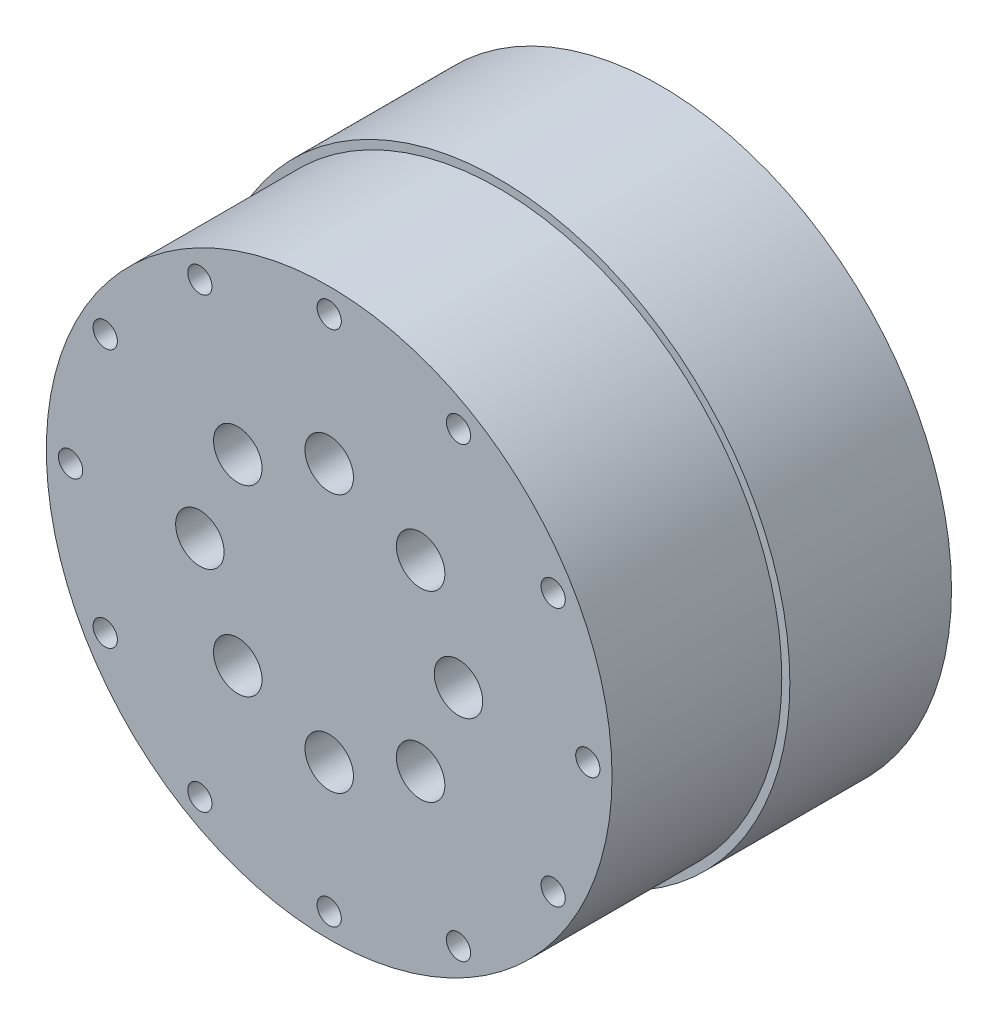
ISO-10303-21;
HEADER;
FILE_DESCRIPTION(('STEP AP214'),'2;1');
FILE_NAME('part.step','',(''),(''),'','','');
FILE_SCHEMA(('AUTOMOTIVE_DESIGN { 1 0 10303 214 1 1 1 1 }'));
ENDSEC;
DATA;
#1=APPLICATION_CONTEXT('core data for automotive mechanical design processes');
#2=APPLICATION_PROTOCOL_DEFINITION('international standard','automotive_design',2000,#1);
#3=PRODUCT_CONTEXT('',#1,'mechanical');
#4=PRODUCT('Part','Part','',(#3));
#5=PRODUCT_RELATED_PRODUCT_CATEGORY('part','',(#4));
#6=PRODUCT_DEFINITION_FORMATION('','',#4);
#7=PRODUCT_DEFINITION_CONTEXT('part definition',#1,'design');
#8=PRODUCT_DEFINITION('design','',#6,#7);
#9=PRODUCT_DEFINITION_SHAPE('','',#8);
#10=(LENGTH_UNIT() NAMED_UNIT(*) SI_UNIT(.MILLI.,.METRE.));
#11=(NAMED_UNIT(*) PLANE_ANGLE_UNIT() SI_UNIT($,.RADIAN.));
#12=(NAMED_UNIT(*) SI_UNIT($,.STERADIAN.) SOLID_ANGLE_UNIT());
#13=UNCERTAINTY_MEASURE_WITH_UNIT(LENGTH_MEASURE(1.E-05),#10,'distance_accuracy_value','');
#14=(GEOMETRIC_REPRESENTATION_CONTEXT(3) GLOBAL_UNCERTAINTY_ASSIGNED_CONTEXT((#13)) GLOBAL_UNIT_ASSIGNED_CONTEXT((#10,
#11,#12)) REPRESENTATION_CONTEXT('',''));
#15=CARTESIAN_POINT('',(0.,0.,0.));
#16=DIRECTION('',(0.,0.,1.));
#17=DIRECTION('',(1.,0.,0.));
#18=AXIS2_PLACEMENT_3D('',#15,#16,#17);
#19=CARTESIAN_POINT('',(0.,0.,41.));
#20=DIRECTION('',(0.,0.,1.));
#21=DIRECTION('',(1.,0.,0.));
#22=AXIS2_PLACEMENT_3D('',#19,#20,#21);
#23=PLANE('',#22);
#24=CARTESIAN_POINT('',(27.712812921102,16.,41.));
#25=DIRECTION('',(0.,0.,1.));
#26=DIRECTION('',(1.,0.,0.));
#27=AXIS2_PLACEMENT_3D('',#24,#25,#26);
#28=CIRCLE('',#27,1.5);
#29=CARTESIAN_POINT('',(29.212812921102,16.,41.));
#30=VERTEX_POINT('',#29);
#31=EDGE_CURVE('E106',#30,#30,#28,.T.);
#32=ORIENTED_EDGE('',*,*,#31,.F.);
#33=EDGE_LOOP('',(#32));
#34=FACE_BOUND('',#33,.T.);
#35=CARTESIAN_POINT('',(0.,32.,41.));
#36=DIRECTION('',(0.,0.,1.));
#37=DIRECTION('',(1.,0.,0.));
#38=AXIS2_PLACEMENT_3D('',#35,#36,#37);
#39=CIRCLE('',#38,1.5);
#40=CARTESIAN_POINT('',(1.5,32.,41.));
#41=VERTEX_POINT('',#40);
#42=EDGE_CURVE('E94',#41,#41,#39,.T.);
#43=ORIENTED_EDGE('',*,*,#42,.F.);
#44=EDGE_LOOP('',(#43));
#45=FACE_BOUND('',#44,.T.);
#46=CARTESIAN_POINT('',(-27.712812921102,16.,41.));
#47=DIRECTION('',(0.,0.,1.));
#48=DIRECTION('',(1.,0.,0.));
#49=AXIS2_PLACEMENT_3D('',#46,#47,#48);
#50=CIRCLE('',#49,1.5);
#51=CARTESIAN_POINT('',(-26.212812921102,16.,41.));
#52=VERTEX_POINT('',#51);
#53=EDGE_CURVE('E82',#52,#52,#50,.T.);
#54=ORIENTED_EDGE('',*,*,#53,.F.);
#55=EDGE_LOOP('',(#54));
#56=FACE_BOUND('',#55,.T.);
#57=CARTESIAN_POINT('',(-27.712812921102,-16.,41.));
#58=DIRECTION('',(0.,0.,1.));
#59=DIRECTION('',(1.,0.,0.));
#60=AXIS2_PLACEMENT_3D('',#57,#58,#59);
#61=CIRCLE('',#60,1.5);
#62=CARTESIAN_POINT('',(-26.212812921102,-16.,41.));
#63=VERTEX_POINT('',#62);
#64=EDGE_CURVE('E70',#63,#63,#61,.T.);
#65=ORIENTED_EDGE('',*,*,#64,.F.);
#66=EDGE_LOOP('',(#65));
#67=FACE_BOUND('',#66,.T.);
#68=CARTESIAN_POINT('',(0.,-32.,41.));
#69=DIRECTION('',(0.,0.,1.));
#70=DIRECTION('',(1.,0.,0.));
#71=AXIS2_PLACEMENT_3D('',#68,#69,#70);
#72=CIRCLE('',#71,1.5);
#73=CARTESIAN_POINT('',(1.5,-32.,41.));
#74=VERTEX_POINT('',#73);
#75=EDGE_CURVE('E58',#74,#74,#72,.T.);
#76=ORIENTED_EDGE('',*,*,#75,.F.);
#77=EDGE_LOOP('',(#76));
#78=FACE_BOUND('',#77,.T.);
#79=CARTESIAN_POINT('',(27.712812921102,-16.,41.));
#80=DIRECTION('',(0.,0.,1.));
#81=DIRECTION('',(1.,0.,0.));
#82=AXIS2_PLACEMENT_3D('',#79,#80,#81);
#83=CIRCLE('',#82,1.5);
#84=CARTESIAN_POINT('',(29.212812921102,-16.,41.));
#85=VERTEX_POINT('',#84);
#86=EDGE_CURVE('E47',#85,#85,#83,.T.);
#87=ORIENTED_EDGE('',*,*,#86,.F.);
#88=EDGE_LOOP('',(#87));
#89=FACE_BOUND('',#88,.T.);
#90=CARTESIAN_POINT('',(32.,0.,41.));
#91=DIRECTION('',(0.,0.,1.));
#92=DIRECTION('',(1.,0.,0.));
#93=AXIS2_PLACEMENT_3D('',#90,#91,#92);
#94=CIRCLE('',#93,1.5);
#95=CARTESIAN_POINT('',(33.5,0.,41.));
#96=VERTEX_POINT('',#95);
#97=EDGE_CURVE('E38',#96,#96,#94,.T.);
#98=ORIENTED_EDGE('',*,*,#97,.F.);
#99=EDGE_LOOP('',(#98));
#100=FACE_BOUND('',#99,.T.);
#101=CARTESIAN_POINT('',(16.,-27.712812921102,41.));
#102=DIRECTION('',(0.,0.,1.));
#103=DIRECTION('',(1.,0.,0.));
#104=AXIS2_PLACEMENT_3D('',#101,#102,#103);
#105=CIRCLE('',#104,1.5);
#106=CARTESIAN_POINT('',(17.5,-27.712812921102,41.));
#107=VERTEX_POINT('',#106);
#108=EDGE_CURVE('E52',#107,#107,#105,.T.);
#109=ORIENTED_EDGE('',*,*,#108,.F.);
#110=EDGE_LOOP('',(#109));
#111=FACE_BOUND('',#110,.T.);
#112=CARTESIAN_POINT('',(-16.,-27.712812921102,41.));
#113=DIRECTION('',(0.,0.,1.));
#114=DIRECTION('',(1.,0.,0.));
#115=AXIS2_PLACEMENT_3D('',#112,#113,#114);
#116=CIRCLE('',#115,1.5);
#117=CARTESIAN_POINT('',(-14.5,-27.712812921102,41.));
#118=VERTEX_POINT('',#117);
#119=EDGE_CURVE('E64',#118,#118,#116,.T.);
#120=ORIENTED_EDGE('',*,*,#119,.F.);
#121=EDGE_LOOP('',(#120));
#122=FACE_BOUND('',#121,.T.);
#123=CARTESIAN_POINT('',(-32.,0.,41.));
#124=DIRECTION('',(0.,0.,1.));
#125=DIRECTION('',(1.,0.,0.));
#126=AXIS2_PLACEMENT_3D('',#123,#124,#125);
#127=CIRCLE('',#126,1.5);
#128=CARTESIAN_POINT('',(-30.5,0.,41.));
#129=VERTEX_POINT('',#128);
#130=EDGE_CURVE('E76',#129,#129,#127,.T.);
#131=ORIENTED_EDGE('',*,*,#130,.F.);
#132=EDGE_LOOP('',(#131));
#133=FACE_BOUND('',#132,.T.);
#134=CARTESIAN_POINT('',(-16.,27.712812921102,41.));
#135=DIRECTION('',(0.,0.,1.));
#136=DIRECTION('',(1.,0.,0.));
#137=AXIS2_PLACEMENT_3D('',#134,#135,#136);
#138=CIRCLE('',#137,1.5);
#139=CARTESIAN_POINT('',(-14.5,27.712812921102,41.));
#140=VERTEX_POINT('',#139);
#141=EDGE_CURVE('E88',#140,#140,#138,.T.);
#142=ORIENTED_EDGE('',*,*,#141,.F.);
#143=EDGE_LOOP('',(#142));
#144=FACE_BOUND('',#143,.T.);
#145=CARTESIAN_POINT('',(16.,27.7128129211021,41.));
#146=DIRECTION('',(0.,0.,1.));
#147=DIRECTION('',(1.,0.,0.));
#148=AXIS2_PLACEMENT_3D('',#145,#146,#147);
#149=CIRCLE('',#148,1.5);
#150=CARTESIAN_POINT('',(17.5,27.7128129211021,41.));
#151=VERTEX_POINT('',#150);
#152=EDGE_CURVE('E100',#151,#151,#149,.T.);
#153=ORIENTED_EDGE('',*,*,#152,.F.);
#154=EDGE_LOOP('',(#153));
#155=FACE_BOUND('',#154,.T.);
#156=CARTESIAN_POINT('',(16.,0.,41.));
#157=DIRECTION('',(0.,0.,1.));
#158=DIRECTION('',(1.,0.,0.));
#159=AXIS2_PLACEMENT_3D('',#156,#157,#158);
#160=CIRCLE('',#159,3.);
#161=CARTESIAN_POINT('',(19.,0.,41.));
#162=VERTEX_POINT('',#161);
#163=EDGE_CURVE('E115',#162,#162,#160,.T.);
#164=ORIENTED_EDGE('',*,*,#163,.F.);
#165=EDGE_LOOP('',(#164));
#166=FACE_BOUND('',#165,.T.);
#167=CARTESIAN_POINT('',(11.3137084989847,-11.3137084989848,41.));
#168=DIRECTION('',(0.,0.,1.));
#169=DIRECTION('',(1.,0.,0.));
#170=AXIS2_PLACEMENT_3D('',#167,#168,#169);
#171=CIRCLE('',#170,3.);
#172=CARTESIAN_POINT('',(14.3137084989847,-11.3137084989848,41.));
#173=VERTEX_POINT('',#172);
#174=EDGE_CURVE('E158',#173,#173,#171,.T.);
#175=ORIENTED_EDGE('',*,*,#174,.F.);
#176=EDGE_LOOP('',(#175));
#177=FACE_BOUND('',#176,.T.);
#178=CARTESIAN_POINT('',(0.,-16.,41.));
#179=DIRECTION('',(0.,0.,1.));
#180=DIRECTION('',(1.,0.,0.));
#181=AXIS2_PLACEMENT_3D('',#178,#179,#180);
#182=CIRCLE('',#181,3.);
#183=CARTESIAN_POINT('',(2.99999999999995,-16.,41.));
#184=VERTEX_POINT('',#183);
#185=EDGE_CURVE('E152',#184,#184,#182,.T.);
#186=ORIENTED_EDGE('',*,*,#185,.F.);
#187=EDGE_LOOP('',(#186));
#188=FACE_BOUND('',#187,.T.);
#189=CARTESIAN_POINT('',(-11.3137084989848,-11.3137084989847,41.));
#190=DIRECTION('',(0.,0.,1.));
#191=DIRECTION('',(1.,0.,0.));
#192=AXIS2_PLACEMENT_3D('',#189,#190,#191);
#193=CIRCLE('',#192,3.);
#194=CARTESIAN_POINT('',(-8.31370849898482,-11.3137084989847,41.));
#195=VERTEX_POINT('',#194);
#196=EDGE_CURVE('E146',#195,#195,#193,.T.);
#197=ORIENTED_EDGE('',*,*,#196,.F.);
#198=EDGE_LOOP('',(#197));
#199=FACE_BOUND('',#198,.T.);
#200=CARTESIAN_POINT('',(-16.,1.1172740284298E-13,41.));
#201=DIRECTION('',(0.,0.,1.));
#202=DIRECTION('',(1.,0.,0.));
#203=AXIS2_PLACEMENT_3D('',#200,#201,#202);
#204=CIRCLE('',#203,3.);
#205=CARTESIAN_POINT('',(-13.,1.1172740284298E-13,41.));
#206=VERTEX_POINT('',#205);
#207=EDGE_CURVE('E140',#206,#206,#204,.T.);
#208=ORIENTED_EDGE('',*,*,#207,.F.);
#209=EDGE_LOOP('',(#208));
#210=FACE_BOUND('',#209,.T.);
#211=CARTESIAN_POINT('',(-11.3137084989847,11.3137084989849,41.));
#212=DIRECTION('',(0.,0.,1.));
#213=DIRECTION('',(1.,0.,0.));
#214=AXIS2_PLACEMENT_3D('',#211,#212,#213);
#215=CIRCLE('',#214,3.);
#216=CARTESIAN_POINT('',(-8.31370849898466,11.3137084989849,41.));
#217=VERTEX_POINT('',#216);
#218=EDGE_CURVE('E134',#217,#217,#215,.T.);
#219=ORIENTED_EDGE('',*,*,#218,.F.);
#220=EDGE_LOOP('',(#219));
#221=FACE_BOUND('',#220,.T.);
#222=CARTESIAN_POINT('',(1.6759110426447E-13,16.,41.));
#223=DIRECTION('',(0.,0.,1.));
#224=DIRECTION('',(1.,0.,0.));
#225=AXIS2_PLACEMENT_3D('',#222,#223,#224);
#226=CIRCLE('',#225,3.);
#227=CARTESIAN_POINT('',(3.00000000000017,16.,41.));
#228=VERTEX_POINT('',#227);
#229=EDGE_CURVE('E128',#228,#228,#226,.T.);
#230=ORIENTED_EDGE('',*,*,#229,.F.);
#231=EDGE_LOOP('',(#230));
#232=FACE_BOUND('',#231,.T.);
#233=CARTESIAN_POINT('',(11.3137084989849,11.3137084989846,41.));
#234=DIRECTION('',(0.,0.,1.));
#235=DIRECTION('',(1.,0.,0.));
#236=AXIS2_PLACEMENT_3D('',#233,#234,#235);
#237=CIRCLE('',#236,3.);
#238=CARTESIAN_POINT('',(14.3137084989849,11.3137084989846,41.));
#239=VERTEX_POINT('',#238);
#240=EDGE_CURVE('E121',#239,#239,#237,.T.);
#241=ORIENTED_EDGE('',*,*,#240,.F.);
#242=EDGE_LOOP('',(#241));
#243=FACE_BOUND('',#242,.T.);
#244=CARTESIAN_POINT('',(0.,0.,41.));
#245=DIRECTION('',(0.,0.,1.));
#246=DIRECTION('',(1.,0.,0.));
#247=AXIS2_PLACEMENT_3D('',#244,#245,#246);
#248=CIRCLE('',#247,35.);
#249=CARTESIAN_POINT('',(35.,0.,41.));
#250=VERTEX_POINT('',#249);
#251=EDGE_CURVE('E196',#250,#250,#248,.T.);
#252=ORIENTED_EDGE('',*,*,#251,.T.);
#253=EDGE_LOOP('',(#252));
#254=FACE_BOUND('',#253,.T.);
#255=ADVANCED_FACE('F31',(#34,#45,#56,#67,#78,#89,#100,#111,#122,#133,#144,#155,#166,#177,#188,
#199,#210,#221,#232,#243,#254),#23,.T.);
#256=CARTESIAN_POINT('',(0.,0.,41.));
#257=DIRECTION('',(0.,0.,-1.));
#258=DIRECTION('',(-1.,0.,0.));
#259=AXIS2_PLACEMENT_3D('',#256,#257,#258);
#260=CYLINDRICAL_SURFACE('',#259,36.);
#261=CARTESIAN_POINT('',(0.,0.,0.));
#262=DIRECTION('',(0.,0.,1.));
#263=DIRECTION('',(1.,0.,0.));
#264=AXIS2_PLACEMENT_3D('',#261,#262,#263);
#265=CIRCLE('',#264,36.);
#266=CARTESIAN_POINT('',(36.,0.,0.));
#267=VERTEX_POINT('',#266);
#268=EDGE_CURVE('E10',#267,#267,#265,.T.);
#269=ORIENTED_EDGE('',*,*,#268,.T.);
#270=EDGE_LOOP('',(#269));
#271=FACE_BOUND('',#270,.T.);
#272=CARTESIAN_POINT('',(0.,0.,20.));
#273=DIRECTION('',(0.,0.,1.));
#274=DIRECTION('',(1.,0.,0.));
#275=AXIS2_PLACEMENT_3D('',#272,#273,#274);
#276=CIRCLE('',#275,36.);
#277=CARTESIAN_POINT('',(36.,0.,20.));
#278=VERTEX_POINT('',#277);
#279=EDGE_CURVE('E173',#278,#278,#276,.T.);
#280=ORIENTED_EDGE('',*,*,#279,.F.);
#281=EDGE_LOOP('',(#280));
#282=FACE_BOUND('',#281,.T.);
#283=ADVANCED_FACE('F33',(#271,#282),#260,.T.);
#284=CARTESIAN_POINT('',(0.,0.,0.));
#285=DIRECTION('',(0.,0.,1.));
#286=DIRECTION('',(1.,0.,0.));
#287=AXIS2_PLACEMENT_3D('',#284,#285,#286);
#288=PLANE('',#287);
#289=CARTESIAN_POINT('',(-7.,0.,0.));
#290=DIRECTION('',(0.,0.,-1.));
#291=DIRECTION('',(-1.,0.,0.));
#292=AXIS2_PLACEMENT_3D('',#289,#290,#291);
#293=CIRCLE('',#292,1.25);
#294=CARTESIAN_POINT('',(-8.25,0.,0.));
#295=VERTEX_POINT('',#294);
#296=EDGE_CURVE('E188',#295,#295,#293,.T.);
#297=ORIENTED_EDGE('',*,*,#296,.F.);
#298=EDGE_LOOP('',(#297));
#299=FACE_BOUND('',#298,.T.);
#300=CARTESIAN_POINT('',(0.,-7.,0.));
#301=DIRECTION('',(0.,0.,-1.));
#302=DIRECTION('',(-1.,0.,0.));
#303=AXIS2_PLACEMENT_3D('',#300,#301,#302);
#304=CIRCLE('',#303,1.25);
#305=CARTESIAN_POINT('',(-1.25,-7.,0.));
#306=VERTEX_POINT('',#305);
#307=EDGE_CURVE('E182',#306,#306,#304,.T.);
#308=ORIENTED_EDGE('',*,*,#307,.F.);
#309=EDGE_LOOP('',(#308));
#310=FACE_BOUND('',#309,.T.);
#311=CARTESIAN_POINT('',(7.,0.,0.));
#312=DIRECTION('',(0.,0.,-1.));
#313=DIRECTION('',(-1.,0.,0.));
#314=AXIS2_PLACEMENT_3D('',#311,#312,#313);
#315=CIRCLE('',#314,1.25);
#316=CARTESIAN_POINT('',(5.75,0.,0.));
#317=VERTEX_POINT('',#316);
#318=EDGE_CURVE('E176',#317,#317,#315,.T.);
#319=ORIENTED_EDGE('',*,*,#318,.F.);
#320=EDGE_LOOP('',(#319));
#321=FACE_BOUND('',#320,.T.);
#322=CARTESIAN_POINT('',(0.,7.,0.));
#323=DIRECTION('',(0.,0.,-1.));
#324=DIRECTION('',(-1.,0.,0.));
#325=AXIS2_PLACEMENT_3D('',#322,#323,#324);
#326=CIRCLE('',#325,1.25);
#327=CARTESIAN_POINT('',(-1.25,7.,0.));
#328=VERTEX_POINT('',#327);
#329=EDGE_CURVE('E169',#328,#328,#326,.T.);
#330=ORIENTED_EDGE('',*,*,#329,.F.);
#331=EDGE_LOOP('',(#330));
#332=FACE_BOUND('',#331,.T.);
#333=CARTESIAN_POINT('',(0.,0.,0.));
#334=DIRECTION('',(0.,0.,-1.));
#335=DIRECTION('',(-1.,0.,0.));
#336=AXIS2_PLACEMENT_3D('',#333,#334,#335);
#337=CIRCLE('',#336,4.);
#338=CARTESIAN_POINT('',(-4.,0.,0.));
#339=VERTEX_POINT('',#338);
#340=EDGE_CURVE('E163',#339,#339,#337,.T.);
#341=ORIENTED_EDGE('',*,*,#340,.F.);
#342=EDGE_LOOP('',(#341));
#343=FACE_BOUND('',#342,.T.);
#344=ORIENTED_EDGE('',*,*,#268,.F.);
#345=EDGE_LOOP('',(#344));
#346=FACE_BOUND('',#345,.T.);
#347=CARTESIAN_POINT('',(32.,0.,0.));
#348=DIRECTION('',(0.,0.,1.));
#349=DIRECTION('',(1.,0.,0.));
#350=AXIS2_PLACEMENT_3D('',#347,#348,#349);
#351=CIRCLE('',#350,1.5);
#352=CARTESIAN_POINT('',(33.5,0.,0.));
#353=VERTEX_POINT('',#352);
#354=EDGE_CURVE('E42',#353,#353,#351,.T.);
#355=ORIENTED_EDGE('',*,*,#354,.T.);
#356=EDGE_LOOP('',(#355));
#357=FACE_BOUND('',#356,.T.);
#358=CARTESIAN_POINT('',(27.712812921102,-16.,0.));
#359=DIRECTION('',(0.,0.,1.));
#360=DIRECTION('',(1.,0.,0.));
#361=AXIS2_PLACEMENT_3D('',#358,#359,#360);
#362=CIRCLE('',#361,1.5);
#363=CARTESIAN_POINT('',(29.212812921102,-16.,0.));
#364=VERTEX_POINT('',#363);
#365=EDGE_CURVE('E49',#364,#364,#362,.T.);
#366=ORIENTED_EDGE('',*,*,#365,.T.);
#367=EDGE_LOOP('',(#366));
#368=FACE_BOUND('',#367,.T.);
#369=CARTESIAN_POINT('',(16.,-27.712812921102,0.));
#370=DIRECTION('',(0.,0.,1.));
#371=DIRECTION('',(1.,0.,0.));
#372=AXIS2_PLACEMENT_3D('',#369,#370,#371);
#373=CIRCLE('',#372,1.5);
#374=CARTESIAN_POINT('',(17.5,-27.712812921102,0.));
#375=VERTEX_POINT('',#374);
#376=EDGE_CURVE('E55',#375,#375,#373,.T.);
#377=ORIENTED_EDGE('',*,*,#376,.T.);
#378=EDGE_LOOP('',(#377));
#379=FACE_BOUND('',#378,.T.);
#380=CARTESIAN_POINT('',(0.,-32.,0.));
#381=DIRECTION('',(0.,0.,1.));
#382=DIRECTION('',(1.,0.,0.));
#383=AXIS2_PLACEMENT_3D('',#380,#381,#382);
#384=CIRCLE('',#383,1.5);
#385=CARTESIAN_POINT('',(1.5,-32.,0.));
#386=VERTEX_POINT('',#385);
#387=EDGE_CURVE('E61',#386,#386,#384,.T.);
#388=ORIENTED_EDGE('',*,*,#387,.T.);
#389=EDGE_LOOP('',(#388));
#390=FACE_BOUND('',#389,.T.);
#391=CARTESIAN_POINT('',(-16.,-27.712812921102,0.));
#392=DIRECTION('',(0.,0.,1.));
#393=DIRECTION('',(1.,0.,0.));
#394=AXIS2_PLACEMENT_3D('',#391,#392,#393);
#395=CIRCLE('',#394,1.5);
#396=CARTESIAN_POINT('',(-14.5,-27.712812921102,0.));
#397=VERTEX_POINT('',#396);
#398=EDGE_CURVE('E67',#397,#397,#395,.T.);
#399=ORIENTED_EDGE('',*,*,#398,.T.);
#400=EDGE_LOOP('',(#399));
#401=FACE_BOUND('',#400,.T.);
#402=CARTESIAN_POINT('',(-27.712812921102,-16.,0.));
#403=DIRECTION('',(0.,0.,1.));
#404=DIRECTION('',(1.,0.,0.));
#405=AXIS2_PLACEMENT_3D('',#402,#403,#404);
#406=CIRCLE('',#405,1.5);
#407=CARTESIAN_POINT('',(-26.212812921102,-16.,0.));
#408=VERTEX_POINT('',#407);
#409=EDGE_CURVE('E73',#408,#408,#406,.T.);
#410=ORIENTED_EDGE('',*,*,#409,.T.);
#411=EDGE_LOOP('',(#410));
#412=FACE_BOUND('',#411,.T.);
#413=CARTESIAN_POINT('',(-32.,0.,0.));
#414=DIRECTION('',(0.,0.,1.));
#415=DIRECTION('',(1.,0.,0.));
#416=AXIS2_PLACEMENT_3D('',#413,#414,#415);
#417=CIRCLE('',#416,1.5);
#418=CARTESIAN_POINT('',(-30.5,0.,0.));
#419=VERTEX_POINT('',#418);
#420=EDGE_CURVE('E79',#419,#419,#417,.T.);
#421=ORIENTED_EDGE('',*,*,#420,.T.);
#422=EDGE_LOOP('',(#421));
#423=FACE_BOUND('',#422,.T.);
#424=CARTESIAN_POINT('',(-27.712812921102,16.,0.));
#425=DIRECTION('',(0.,0.,1.));
#426=DIRECTION('',(1.,0.,0.));
#427=AXIS2_PLACEMENT_3D('',#424,#425,#426);
#428=CIRCLE('',#427,1.5);
#429=CARTESIAN_POINT('',(-26.212812921102,16.,0.));
#430=VERTEX_POINT('',#429);
#431=EDGE_CURVE('E85',#430,#430,#428,.T.);
#432=ORIENTED_EDGE('',*,*,#431,.T.);
#433=EDGE_LOOP('',(#432));
#434=FACE_BOUND('',#433,.T.);
#435=CARTESIAN_POINT('',(-16.,27.712812921102,0.));
#436=DIRECTION('',(0.,0.,1.));
#437=DIRECTION('',(1.,0.,0.));
#438=AXIS2_PLACEMENT_3D('',#435,#436,#437);
#439=CIRCLE('',#438,1.5);
#440=CARTESIAN_POINT('',(-14.5,27.712812921102,0.));
#441=VERTEX_POINT('',#440);
#442=EDGE_CURVE('E91',#441,#441,#439,.T.);
#443=ORIENTED_EDGE('',*,*,#442,.T.);
#444=EDGE_LOOP('',(#443));
#445=FACE_BOUND('',#444,.T.);
#446=CARTESIAN_POINT('',(0.,32.,0.));
#447=DIRECTION('',(0.,0.,1.));
#448=DIRECTION('',(1.,0.,0.));
#449=AXIS2_PLACEMENT_3D('',#446,#447,#448);
#450=CIRCLE('',#449,1.5);
#451=CARTESIAN_POINT('',(1.5,32.,0.));
#452=VERTEX_POINT('',#451);
#453=EDGE_CURVE('E97',#452,#452,#450,.T.);
#454=ORIENTED_EDGE('',*,*,#453,.T.);
#455=EDGE_LOOP('',(#454));
#456=FACE_BOUND('',#455,.T.);
#457=CARTESIAN_POINT('',(16.,27.7128129211021,0.));
#458=DIRECTION('',(0.,0.,1.));
#459=DIRECTION('',(1.,0.,0.));
#460=AXIS2_PLACEMENT_3D('',#457,#458,#459);
#461=CIRCLE('',#460,1.5);
#462=CARTESIAN_POINT('',(17.5,27.7128129211021,0.));
#463=VERTEX_POINT('',#462);
#464=EDGE_CURVE('E103',#463,#463,#461,.T.);
#465=ORIENTED_EDGE('',*,*,#464,.T.);
#466=EDGE_LOOP('',(#465));
#467=FACE_BOUND('',#466,.T.);
#468=CARTESIAN_POINT('',(27.712812921102,16.,0.));
#469=DIRECTION('',(0.,0.,1.));
#470=DIRECTION('',(1.,0.,0.));
#471=AXIS2_PLACEMENT_3D('',#468,#469,#470);
#472=CIRCLE('',#471,1.5);
#473=CARTESIAN_POINT('',(29.212812921102,16.,0.));
#474=VERTEX_POINT('',#473);
#475=EDGE_CURVE('E109',#474,#474,#472,.T.);
#476=ORIENTED_EDGE('',*,*,#475,.T.);
#477=EDGE_LOOP('',(#476));
#478=FACE_BOUND('',#477,.T.);
#479=ADVANCED_FACE('F213',(#299,#310,#321,#332,#343,#346,#357,#368,#379,#390,#401,#412,#423,
#434,#445,#456,#467,#478),#288,.F.);
#480=CARTESIAN_POINT('',(32.,0.,41.));
#481=DIRECTION('',(0.,0.,-1.));
#482=DIRECTION('',(-1.,0.,0.));
#483=AXIS2_PLACEMENT_3D('',#480,#481,#482);
#484=CYLINDRICAL_SURFACE('',#483,1.5);
#485=ORIENTED_EDGE('',*,*,#97,.T.);
#486=EDGE_LOOP('',(#485));
#487=FACE_BOUND('',#486,.T.);
#488=ORIENTED_EDGE('',*,*,#354,.F.);
#489=EDGE_LOOP('',(#488));
#490=FACE_BOUND('',#489,.T.);
#491=ADVANCED_FACE('F218',(#487,#490),#484,.F.);
#492=CARTESIAN_POINT('',(27.712812921102,-16.,41.));
#493=DIRECTION('',(0.,0.,-1.));
#494=DIRECTION('',(-1.,0.,0.));
#495=AXIS2_PLACEMENT_3D('',#492,#493,#494);
#496=CYLINDRICAL_SURFACE('',#495,1.5);
#497=ORIENTED_EDGE('',*,*,#86,.T.);
#498=EDGE_LOOP('',(#497));
#499=FACE_BOUND('',#498,.T.);
#500=ORIENTED_EDGE('',*,*,#365,.F.);
#501=EDGE_LOOP('',(#500));
#502=FACE_BOUND('',#501,.T.);
#503=ADVANCED_FACE('F229',(#499,#502),#496,.F.);
#504=CARTESIAN_POINT('',(16.,-27.712812921102,41.));
#505=DIRECTION('',(0.,0.,-1.));
#506=DIRECTION('',(-1.,0.,0.));
#507=AXIS2_PLACEMENT_3D('',#504,#505,#506);
#508=CYLINDRICAL_SURFACE('',#507,1.5);
#509=ORIENTED_EDGE('',*,*,#108,.T.);
#510=EDGE_LOOP('',(#509));
#511=FACE_BOUND('',#510,.T.);
#512=ORIENTED_EDGE('',*,*,#376,.F.);
#513=EDGE_LOOP('',(#512));
#514=FACE_BOUND('',#513,.T.);
#515=ADVANCED_FACE('F232',(#511,#514),#508,.F.);
#516=CARTESIAN_POINT('',(0.,-32.,41.));
#517=DIRECTION('',(0.,0.,-1.));
#518=DIRECTION('',(-1.,0.,0.));
#519=AXIS2_PLACEMENT_3D('',#516,#517,#518);
#520=CYLINDRICAL_SURFACE('',#519,1.5);
#521=ORIENTED_EDGE('',*,*,#75,.T.);
#522=EDGE_LOOP('',(#521));
#523=FACE_BOUND('',#522,.T.);
#524=ORIENTED_EDGE('',*,*,#387,.F.);
#525=EDGE_LOOP('',(#524));
#526=FACE_BOUND('',#525,.T.);
#527=ADVANCED_FACE('F236',(#523,#526),#520,.F.);
#528=CARTESIAN_POINT('',(-16.,-27.712812921102,41.));
#529=DIRECTION('',(0.,0.,-1.));
#530=DIRECTION('',(-1.,0.,0.));
#531=AXIS2_PLACEMENT_3D('',#528,#529,#530);
#532=CYLINDRICAL_SURFACE('',#531,1.5);
#533=ORIENTED_EDGE('',*,*,#119,.T.);
#534=EDGE_LOOP('',(#533));
#535=FACE_BOUND('',#534,.T.);
#536=ORIENTED_EDGE('',*,*,#398,.F.);
#537=EDGE_LOOP('',(#536));
#538=FACE_BOUND('',#537,.T.);
#539=ADVANCED_FACE('F240',(#535,#538),#532,.F.);
#540=CARTESIAN_POINT('',(-27.712812921102,-16.,41.));
#541=DIRECTION('',(0.,0.,-1.));
#542=DIRECTION('',(-1.,0.,0.));
#543=AXIS2_PLACEMENT_3D('',#540,#541,#542);
#544=CYLINDRICAL_SURFACE('',#543,1.5);
#545=ORIENTED_EDGE('',*,*,#64,.T.);
#546=EDGE_LOOP('',(#545));
#547=FACE_BOUND('',#546,.T.);
#548=ORIENTED_EDGE('',*,*,#409,.F.);
#549=EDGE_LOOP('',(#548));
#550=FACE_BOUND('',#549,.T.);
#551=ADVANCED_FACE('F244',(#547,#550),#544,.F.);
#552=CARTESIAN_POINT('',(-32.,0.,41.));
#553=DIRECTION('',(0.,0.,-1.));
#554=DIRECTION('',(-1.,0.,0.));
#555=AXIS2_PLACEMENT_3D('',#552,#553,#554);
#556=CYLINDRICAL_SURFACE('',#555,1.5);
#557=ORIENTED_EDGE('',*,*,#130,.T.);
#558=EDGE_LOOP('',(#557));
#559=FACE_BOUND('',#558,.T.);
#560=ORIENTED_EDGE('',*,*,#420,.F.);
#561=EDGE_LOOP('',(#560));
#562=FACE_BOUND('',#561,.T.);
#563=ADVANCED_FACE('F248',(#559,#562),#556,.F.);
#564=CARTESIAN_POINT('',(-27.712812921102,16.,41.));
#565=DIRECTION('',(0.,0.,-1.));
#566=DIRECTION('',(-1.,0.,0.));
#567=AXIS2_PLACEMENT_3D('',#564,#565,#566);
#568=CYLINDRICAL_SURFACE('',#567,1.5);
#569=ORIENTED_EDGE('',*,*,#53,.T.);
#570=EDGE_LOOP('',(#569));
#571=FACE_BOUND('',#570,.T.);
#572=ORIENTED_EDGE('',*,*,#431,.F.);
#573=EDGE_LOOP('',(#572));
#574=FACE_BOUND('',#573,.T.);
#575=ADVANCED_FACE('F252',(#571,#574),#568,.F.);
#576=CARTESIAN_POINT('',(-16.,27.712812921102,41.));
#577=DIRECTION('',(0.,0.,-1.));
#578=DIRECTION('',(-1.,0.,0.));
#579=AXIS2_PLACEMENT_3D('',#576,#577,#578);
#580=CYLINDRICAL_SURFACE('',#579,1.5);
#581=ORIENTED_EDGE('',*,*,#141,.T.);
#582=EDGE_LOOP('',(#581));
#583=FACE_BOUND('',#582,.T.);
#584=ORIENTED_EDGE('',*,*,#442,.F.);
#585=EDGE_LOOP('',(#584));
#586=FACE_BOUND('',#585,.T.);
#587=ADVANCED_FACE('F256',(#583,#586),#580,.F.);
#588=CARTESIAN_POINT('',(0.,32.,41.));
#589=DIRECTION('',(0.,0.,-1.));
#590=DIRECTION('',(-1.,0.,0.));
#591=AXIS2_PLACEMENT_3D('',#588,#589,#590);
#592=CYLINDRICAL_SURFACE('',#591,1.5);
#593=ORIENTED_EDGE('',*,*,#42,.T.);
#594=EDGE_LOOP('',(#593));
#595=FACE_BOUND('',#594,.T.);
#596=ORIENTED_EDGE('',*,*,#453,.F.);
#597=EDGE_LOOP('',(#596));
#598=FACE_BOUND('',#597,.T.);
#599=ADVANCED_FACE('F260',(#595,#598),#592,.F.);
#600=CARTESIAN_POINT('',(16.,27.7128129211021,41.));
#601=DIRECTION('',(0.,0.,-1.));
#602=DIRECTION('',(-1.,0.,0.));
#603=AXIS2_PLACEMENT_3D('',#600,#601,#602);
#604=CYLINDRICAL_SURFACE('',#603,1.5);
#605=ORIENTED_EDGE('',*,*,#152,.T.);
#606=EDGE_LOOP('',(#605));
#607=FACE_BOUND('',#606,.T.);
#608=ORIENTED_EDGE('',*,*,#464,.F.);
#609=EDGE_LOOP('',(#608));
#610=FACE_BOUND('',#609,.T.);
#611=ADVANCED_FACE('F264',(#607,#610),#604,.F.);
#612=CARTESIAN_POINT('',(27.712812921102,16.,41.));
#613=DIRECTION('',(0.,0.,-1.));
#614=DIRECTION('',(-1.,0.,0.));
#615=AXIS2_PLACEMENT_3D('',#612,#613,#614);
#616=CYLINDRICAL_SURFACE('',#615,1.5);
#617=ORIENTED_EDGE('',*,*,#31,.T.);
#618=EDGE_LOOP('',(#617));
#619=FACE_BOUND('',#618,.T.);
#620=ORIENTED_EDGE('',*,*,#475,.F.);
#621=EDGE_LOOP('',(#620));
#622=FACE_BOUND('',#621,.T.);
#623=ADVANCED_FACE('F268',(#619,#622),#616,.F.);
#624=CARTESIAN_POINT('',(16.,0.,29.));
#625=DIRECTION('',(0.,0.,1.));
#626=DIRECTION('',(1.,0.,0.));
#627=AXIS2_PLACEMENT_3D('',#624,#625,#626);
#628=CYLINDRICAL_SURFACE('',#627,3.);
#629=CARTESIAN_POINT('',(16.,0.,29.));
#630=DIRECTION('',(0.,0.,1.));
#631=DIRECTION('',(1.,0.,0.));
#632=AXIS2_PLACEMENT_3D('',#629,#630,#631);
#633=CIRCLE('',#632,3.);
#634=CARTESIAN_POINT('',(19.,0.,29.));
#635=VERTEX_POINT('',#634);
#636=EDGE_CURVE('E112',#635,#635,#633,.T.);
#637=ORIENTED_EDGE('',*,*,#636,.F.);
#638=EDGE_LOOP('',(#637));
#639=FACE_BOUND('',#638,.T.);
#640=ORIENTED_EDGE('',*,*,#163,.T.);
#641=EDGE_LOOP('',(#640));
#642=FACE_BOUND('',#641,.T.);
#643=ADVANCED_FACE('F272',(#639,#642),#628,.F.);
#644=CARTESIAN_POINT('',(16.,0.,29.));
#645=DIRECTION('',(0.,0.,1.));
#646=DIRECTION('',(1.,0.,0.));
#647=AXIS2_PLACEMENT_3D('',#644,#645,#646);
#648=PLANE('',#647);
#649=ORIENTED_EDGE('',*,*,#636,.T.);
#650=EDGE_LOOP('',(#649));
#651=FACE_BOUND('',#650,.T.);
#652=ADVANCED_FACE('F276',(#651),#648,.T.);
#653=CARTESIAN_POINT('',(11.3137084989847,-11.3137084989848,29.));
#654=DIRECTION('',(0.,0.,1.));
#655=DIRECTION('',(1.,0.,0.));
#656=AXIS2_PLACEMENT_3D('',#653,#654,#655);
#657=CYLINDRICAL_SURFACE('',#656,3.);
#658=CARTESIAN_POINT('',(11.3137084989847,-11.3137084989848,29.));
#659=DIRECTION('',(0.,0.,1.));
#660=DIRECTION('',(1.,0.,0.));
#661=AXIS2_PLACEMENT_3D('',#658,#659,#660);
#662=CIRCLE('',#661,3.);
#663=CARTESIAN_POINT('',(14.3137084989847,-11.3137084989848,29.));
#664=VERTEX_POINT('',#663);
#665=EDGE_CURVE('E118',#664,#664,#662,.T.);
#666=ORIENTED_EDGE('',*,*,#665,.F.);
#667=EDGE_LOOP('',(#666));
#668=FACE_BOUND('',#667,.T.);
#669=ORIENTED_EDGE('',*,*,#174,.T.);
#670=EDGE_LOOP('',(#669));
#671=FACE_BOUND('',#670,.T.);
#672=ADVANCED_FACE('F280',(#668,#671),#657,.F.);
#673=CARTESIAN_POINT('',(11.3137084989847,-11.3137084989848,29.));
#674=DIRECTION('',(0.,0.,1.));
#675=DIRECTION('',(1.,0.,0.));
#676=AXIS2_PLACEMENT_3D('',#673,#674,#675);
#677=PLANE('',#676);
#678=ORIENTED_EDGE('',*,*,#665,.T.);
#679=EDGE_LOOP('',(#678));
#680=FACE_BOUND('',#679,.T.);
#681=ADVANCED_FACE('F327',(#680),#677,.T.);
#682=CARTESIAN_POINT('',(0.,-16.,29.));
#683=DIRECTION('',(0.,0.,1.));
#684=DIRECTION('',(1.,0.,0.));
#685=AXIS2_PLACEMENT_3D('',#682,#683,#684);
#686=CYLINDRICAL_SURFACE('',#685,3.);
#687=CARTESIAN_POINT('',(0.,-16.,29.));
#688=DIRECTION('',(0.,0.,1.));
#689=DIRECTION('',(1.,0.,0.));
#690=AXIS2_PLACEMENT_3D('',#687,#688,#689);
#691=CIRCLE('',#690,3.);
#692=CARTESIAN_POINT('',(2.99999999999995,-16.,29.));
#693=VERTEX_POINT('',#692);
#694=EDGE_CURVE('E155',#693,#693,#691,.T.);
#695=ORIENTED_EDGE('',*,*,#694,.F.);
#696=EDGE_LOOP('',(#695));
#697=FACE_BOUND('',#696,.T.);
#698=ORIENTED_EDGE('',*,*,#185,.T.);
#699=EDGE_LOOP('',(#698));
#700=FACE_BOUND('',#699,.T.);
#701=ADVANCED_FACE('F324',(#697,#700),#686,.F.);
#702=CARTESIAN_POINT('',(0.,-16.,29.));
#703=DIRECTION('',(0.,0.,1.));
#704=DIRECTION('',(1.,0.,0.));
#705=AXIS2_PLACEMENT_3D('',#702,#703,#704);
#706=PLANE('',#705);
#707=ORIENTED_EDGE('',*,*,#694,.T.);
#708=EDGE_LOOP('',(#707));
#709=FACE_BOUND('',#708,.T.);
#710=ADVANCED_FACE('F319',(#709),#706,.T.);
#711=CARTESIAN_POINT('',(-11.3137084989848,-11.3137084989847,29.));
#712=DIRECTION('',(0.,0.,1.));
#713=DIRECTION('',(1.,0.,0.));
#714=AXIS2_PLACEMENT_3D('',#711,#712,#713);
#715=CYLINDRICAL_SURFACE('',#714,3.);
#716=CARTESIAN_POINT('',(-11.3137084989848,-11.3137084989847,29.));
#717=DIRECTION('',(0.,0.,1.));
#718=DIRECTION('',(1.,0.,0.));
#719=AXIS2_PLACEMENT_3D('',#716,#717,#718);
#720=CIRCLE('',#719,3.);
#721=CARTESIAN_POINT('',(-8.31370849898482,-11.3137084989847,29.));
#722=VERTEX_POINT('',#721);
#723=EDGE_CURVE('E149',#722,#722,#720,.T.);
#724=ORIENTED_EDGE('',*,*,#723,.F.);
#725=EDGE_LOOP('',(#724));
#726=FACE_BOUND('',#725,.T.);
#727=ORIENTED_EDGE('',*,*,#196,.T.);
#728=EDGE_LOOP('',(#727));
#729=FACE_BOUND('',#728,.T.);
#730=ADVANCED_FACE('F316',(#726,#729),#715,.F.);
#731=CARTESIAN_POINT('',(-11.3137084989848,-11.3137084989847,29.));
#732=DIRECTION('',(0.,0.,1.));
#733=DIRECTION('',(1.,0.,0.));
#734=AXIS2_PLACEMENT_3D('',#731,#732,#733);
#735=PLANE('',#734);
#736=ORIENTED_EDGE('',*,*,#723,.T.);
#737=EDGE_LOOP('',(#736));
#738=FACE_BOUND('',#737,.T.);
#739=ADVANCED_FACE('F311',(#738),#735,.T.);
#740=CARTESIAN_POINT('',(-16.,1.1172740284298E-13,29.));
#741=DIRECTION('',(0.,0.,1.));
#742=DIRECTION('',(1.,0.,0.));
#743=AXIS2_PLACEMENT_3D('',#740,#741,#742);
#744=CYLINDRICAL_SURFACE('',#743,3.);
#745=CARTESIAN_POINT('',(-16.,1.1172740284298E-13,29.));
#746=DIRECTION('',(0.,0.,1.));
#747=DIRECTION('',(1.,0.,0.));
#748=AXIS2_PLACEMENT_3D('',#745,#746,#747);
#749=CIRCLE('',#748,3.);
#750=CARTESIAN_POINT('',(-13.,1.1172740284298E-13,29.));
#751=VERTEX_POINT('',#750);
#752=EDGE_CURVE('E143',#751,#751,#749,.T.);
#753=ORIENTED_EDGE('',*,*,#752,.F.);
#754=EDGE_LOOP('',(#753));
#755=FACE_BOUND('',#754,.T.);
#756=ORIENTED_EDGE('',*,*,#207,.T.);
#757=EDGE_LOOP('',(#756));
#758=FACE_BOUND('',#757,.T.);
#759=ADVANCED_FACE('F308',(#755,#758),#744,.F.);
#760=CARTESIAN_POINT('',(-16.,1.1172740284298E-13,29.));
#761=DIRECTION('',(0.,0.,1.));
#762=DIRECTION('',(1.,0.,0.));
#763=AXIS2_PLACEMENT_3D('',#760,#761,#762);
#764=PLANE('',#763);
#765=ORIENTED_EDGE('',*,*,#752,.T.);
#766=EDGE_LOOP('',(#765));
#767=FACE_BOUND('',#766,.T.);
#768=ADVANCED_FACE('F303',(#767),#764,.T.);
#769=CARTESIAN_POINT('',(-11.3137084989847,11.3137084989849,29.));
#770=DIRECTION('',(0.,0.,1.));
#771=DIRECTION('',(1.,0.,0.));
#772=AXIS2_PLACEMENT_3D('',#769,#770,#771);
#773=CYLINDRICAL_SURFACE('',#772,3.);
#774=CARTESIAN_POINT('',(-11.3137084989847,11.3137084989849,29.));
#775=DIRECTION('',(0.,0.,1.));
#776=DIRECTION('',(1.,0.,0.));
#777=AXIS2_PLACEMENT_3D('',#774,#775,#776);
#778=CIRCLE('',#777,3.);
#779=CARTESIAN_POINT('',(-8.31370849898466,11.3137084989849,29.));
#780=VERTEX_POINT('',#779);
#781=EDGE_CURVE('E137',#780,#780,#778,.T.);
#782=ORIENTED_EDGE('',*,*,#781,.F.);
#783=EDGE_LOOP('',(#782));
#784=FACE_BOUND('',#783,.T.);
#785=ORIENTED_EDGE('',*,*,#218,.T.);
#786=EDGE_LOOP('',(#785));
#787=FACE_BOUND('',#786,.T.);
#788=ADVANCED_FACE('F300',(#784,#787),#773,.F.);
#789=CARTESIAN_POINT('',(-11.3137084989847,11.3137084989849,29.));
#790=DIRECTION('',(0.,0.,1.));
#791=DIRECTION('',(1.,0.,0.));
#792=AXIS2_PLACEMENT_3D('',#789,#790,#791);
#793=PLANE('',#792);
#794=ORIENTED_EDGE('',*,*,#781,.T.);
#795=EDGE_LOOP('',(#794));
#796=FACE_BOUND('',#795,.T.);
#797=ADVANCED_FACE('F295',(#796),#793,.T.);
#798=CARTESIAN_POINT('',(1.6759110426447E-13,16.,29.));
#799=DIRECTION('',(0.,0.,1.));
#800=DIRECTION('',(1.,0.,0.));
#801=AXIS2_PLACEMENT_3D('',#798,#799,#800);
#802=CYLINDRICAL_SURFACE('',#801,3.);
#803=CARTESIAN_POINT('',(1.6759110426447E-13,16.,29.));
#804=DIRECTION('',(0.,0.,1.));
#805=DIRECTION('',(1.,0.,0.));
#806=AXIS2_PLACEMENT_3D('',#803,#804,#805);
#807=CIRCLE('',#806,3.);
#808=CARTESIAN_POINT('',(3.00000000000017,16.,29.));
#809=VERTEX_POINT('',#808);
#810=EDGE_CURVE('E131',#809,#809,#807,.T.);
#811=ORIENTED_EDGE('',*,*,#810,.F.);
#812=EDGE_LOOP('',(#811));
#813=FACE_BOUND('',#812,.T.);
#814=ORIENTED_EDGE('',*,*,#229,.T.);
#815=EDGE_LOOP('',(#814));
#816=FACE_BOUND('',#815,.T.);
#817=ADVANCED_FACE('F292',(#813,#816),#802,.F.);
#818=CARTESIAN_POINT('',(1.6759110426447E-13,16.,29.));
#819=DIRECTION('',(0.,0.,1.));
#820=DIRECTION('',(1.,0.,0.));
#821=AXIS2_PLACEMENT_3D('',#818,#819,#820);
#822=PLANE('',#821);
#823=ORIENTED_EDGE('',*,*,#810,.T.);
#824=EDGE_LOOP('',(#823));
#825=FACE_BOUND('',#824,.T.);
#826=ADVANCED_FACE('F286',(#825),#822,.T.);
#827=CARTESIAN_POINT('',(11.3137084989849,11.3137084989846,29.));
#828=DIRECTION('',(0.,0.,1.));
#829=DIRECTION('',(1.,0.,0.));
#830=AXIS2_PLACEMENT_3D('',#827,#828,#829);
#831=CYLINDRICAL_SURFACE('',#830,3.);
#832=CARTESIAN_POINT('',(11.3137084989849,11.3137084989846,29.));
#833=DIRECTION('',(0.,0.,1.));
#834=DIRECTION('',(1.,0.,0.));
#835=AXIS2_PLACEMENT_3D('',#832,#833,#834);
#836=CIRCLE('',#835,3.);
#837=CARTESIAN_POINT('',(14.3137084989849,11.3137084989846,29.));
#838=VERTEX_POINT('',#837);
#839=EDGE_CURVE('E124',#838,#838,#836,.T.);
#840=ORIENTED_EDGE('',*,*,#839,.F.);
#841=EDGE_LOOP('',(#840));
#842=FACE_BOUND('',#841,.T.);
#843=ORIENTED_EDGE('',*,*,#240,.T.);
#844=EDGE_LOOP('',(#843));
#845=FACE_BOUND('',#844,.T.);
#846=ADVANCED_FACE('F282',(#842,#845),#831,.F.);
#847=CARTESIAN_POINT('',(11.3137084989849,11.3137084989846,29.));
#848=DIRECTION('',(0.,0.,1.));
#849=DIRECTION('',(1.,0.,0.));
#850=AXIS2_PLACEMENT_3D('',#847,#848,#849);
#851=PLANE('',#850);
#852=ORIENTED_EDGE('',*,*,#839,.T.);
#853=EDGE_LOOP('',(#852));
#854=FACE_BOUND('',#853,.T.);
#855=ADVANCED_FACE('F285',(#854),#851,.T.);
#856=CARTESIAN_POINT('',(0.,0.,12.));
#857=DIRECTION('',(0.,0.,-1.));
#858=DIRECTION('',(-1.,0.,0.));
#859=AXIS2_PLACEMENT_3D('',#856,#857,#858);
#860=CYLINDRICAL_SURFACE('',#859,4.);
#861=CARTESIAN_POINT('',(0.,0.,12.));
#862=DIRECTION('',(0.,0.,-1.));
#863=DIRECTION('',(-1.,0.,0.));
#864=AXIS2_PLACEMENT_3D('',#861,#862,#863);
#865=CIRCLE('',#864,4.);
#866=CARTESIAN_POINT('',(-4.,0.,12.));
#867=VERTEX_POINT('',#866);
#868=EDGE_CURVE('E125',#867,#867,#865,.T.);
#869=ORIENTED_EDGE('',*,*,#868,.F.);
#870=EDGE_LOOP('',(#869));
#871=FACE_BOUND('',#870,.T.);
#872=ORIENTED_EDGE('',*,*,#340,.T.);
#873=EDGE_LOOP('',(#872));
#874=FACE_BOUND('',#873,.T.);
#875=ADVANCED_FACE('F290',(#871,#874),#860,.F.);
#876=CARTESIAN_POINT('',(0.,0.,12.));
#877=DIRECTION('',(0.,0.,-1.));
#878=DIRECTION('',(-1.,0.,0.));
#879=AXIS2_PLACEMENT_3D('',#876,#877,#878);
#880=PLANE('',#879);
#881=ORIENTED_EDGE('',*,*,#868,.T.);
#882=EDGE_LOOP('',(#881));
#883=FACE_BOUND('',#882,.T.);
#884=ADVANCED_FACE('F340',(#883),#880,.T.);
#885=CARTESIAN_POINT('',(0.,7.,12.));
#886=DIRECTION('',(0.,0.,-1.));
#887=DIRECTION('',(-1.,0.,0.));
#888=AXIS2_PLACEMENT_3D('',#885,#886,#887);
#889=CYLINDRICAL_SURFACE('',#888,1.25);
#890=CARTESIAN_POINT('',(0.,7.,12.));
#891=DIRECTION('',(0.,0.,-1.));
#892=DIRECTION('',(-1.,0.,0.));
#893=AXIS2_PLACEMENT_3D('',#890,#891,#892);
#894=CIRCLE('',#893,1.25);
#895=CARTESIAN_POINT('',(-1.25,7.,12.));
#896=VERTEX_POINT('',#895);
#897=EDGE_CURVE('E172',#896,#896,#894,.T.);
#898=ORIENTED_EDGE('',*,*,#897,.F.);
#899=EDGE_LOOP('',(#898));
#900=FACE_BOUND('',#899,.T.);
#901=ORIENTED_EDGE('',*,*,#329,.T.);
#902=EDGE_LOOP('',(#901));
#903=FACE_BOUND('',#902,.T.);
#904=ADVANCED_FACE('F344',(#900,#903),#889,.F.);
#905=CARTESIAN_POINT('',(0.,7.,12.));
#906=DIRECTION('',(0.,0.,-1.));
#907=DIRECTION('',(-1.,0.,0.));
#908=AXIS2_PLACEMENT_3D('',#905,#906,#907);
#909=PLANE('',#908);
#910=ORIENTED_EDGE('',*,*,#897,.T.);
#911=EDGE_LOOP('',(#910));
#912=FACE_BOUND('',#911,.T.);
#913=ADVANCED_FACE('F348',(#912),#909,.T.);
#914=CARTESIAN_POINT('',(7.,0.,12.));
#915=DIRECTION('',(0.,0.,-1.));
#916=DIRECTION('',(-1.,0.,0.));
#917=AXIS2_PLACEMENT_3D('',#914,#915,#916);
#918=CYLINDRICAL_SURFACE('',#917,1.25);
#919=CARTESIAN_POINT('',(7.,0.,12.));
#920=DIRECTION('',(0.,0.,-1.));
#921=DIRECTION('',(-1.,0.,0.));
#922=AXIS2_PLACEMENT_3D('',#919,#920,#921);
#923=CIRCLE('',#922,1.25);
#924=CARTESIAN_POINT('',(5.75,0.,12.));
#925=VERTEX_POINT('',#924);
#926=EDGE_CURVE('E179',#925,#925,#923,.T.);
#927=ORIENTED_EDGE('',*,*,#926,.F.);
#928=EDGE_LOOP('',(#927));
#929=FACE_BOUND('',#928,.T.);
#930=ORIENTED_EDGE('',*,*,#318,.T.);
#931=EDGE_LOOP('',(#930));
#932=FACE_BOUND('',#931,.T.);
#933=ADVANCED_FACE('F352',(#929,#932),#918,.F.);
#934=CARTESIAN_POINT('',(7.,0.,12.));
#935=DIRECTION('',(0.,0.,-1.));
#936=DIRECTION('',(-1.,0.,0.));
#937=AXIS2_PLACEMENT_3D('',#934,#935,#936);
#938=PLANE('',#937);
#939=ORIENTED_EDGE('',*,*,#926,.T.);
#940=EDGE_LOOP('',(#939));
#941=FACE_BOUND('',#940,.T.);
#942=ADVANCED_FACE('F356',(#941),#938,.T.);
#943=CARTESIAN_POINT('',(0.,-7.,12.));
#944=DIRECTION('',(0.,0.,-1.));
#945=DIRECTION('',(-1.,0.,0.));
#946=AXIS2_PLACEMENT_3D('',#943,#944,#945);
#947=CYLINDRICAL_SURFACE('',#946,1.25);
#948=CARTESIAN_POINT('',(0.,-7.,12.));
#949=DIRECTION('',(0.,0.,-1.));
#950=DIRECTION('',(-1.,0.,0.));
#951=AXIS2_PLACEMENT_3D('',#948,#949,#950);
#952=CIRCLE('',#951,1.25);
#953=CARTESIAN_POINT('',(-1.25,-7.,12.));
#954=VERTEX_POINT('',#953);
#955=EDGE_CURVE('E185',#954,#954,#952,.T.);
#956=ORIENTED_EDGE('',*,*,#955,.F.);
#957=EDGE_LOOP('',(#956));
#958=FACE_BOUND('',#957,.T.);
#959=ORIENTED_EDGE('',*,*,#307,.T.);
#960=EDGE_LOOP('',(#959));
#961=FACE_BOUND('',#960,.T.);
#962=ADVANCED_FACE('F360',(#958,#961),#947,.F.);
#963=CARTESIAN_POINT('',(0.,-7.,12.));
#964=DIRECTION('',(0.,0.,-1.));
#965=DIRECTION('',(-1.,0.,0.));
#966=AXIS2_PLACEMENT_3D('',#963,#964,#965);
#967=PLANE('',#966);
#968=ORIENTED_EDGE('',*,*,#955,.T.);
#969=EDGE_LOOP('',(#968));
#970=FACE_BOUND('',#969,.T.);
#971=ADVANCED_FACE('F364',(#970),#967,.T.);
#972=CARTESIAN_POINT('',(-7.,0.,12.));
#973=DIRECTION('',(0.,0.,-1.));
#974=DIRECTION('',(-1.,0.,0.));
#975=AXIS2_PLACEMENT_3D('',#972,#973,#974);
#976=CYLINDRICAL_SURFACE('',#975,1.25);
#977=CARTESIAN_POINT('',(-7.,0.,12.));
#978=DIRECTION('',(0.,0.,-1.));
#979=DIRECTION('',(-1.,0.,0.));
#980=AXIS2_PLACEMENT_3D('',#977,#978,#979);
#981=CIRCLE('',#980,1.25);
#982=CARTESIAN_POINT('',(-8.25,0.,12.));
#983=VERTEX_POINT('',#982);
#984=EDGE_CURVE('E166',#983,#983,#981,.T.);
#985=ORIENTED_EDGE('',*,*,#984,.F.);
#986=EDGE_LOOP('',(#985));
#987=FACE_BOUND('',#986,.T.);
#988=ORIENTED_EDGE('',*,*,#296,.T.);
#989=EDGE_LOOP('',(#988));
#990=FACE_BOUND('',#989,.T.);
#991=ADVANCED_FACE('F368',(#987,#990),#976,.F.);
#992=CARTESIAN_POINT('',(-7.,0.,12.));
#993=DIRECTION('',(0.,0.,-1.));
#994=DIRECTION('',(-1.,0.,0.));
#995=AXIS2_PLACEMENT_3D('',#992,#993,#994);
#996=PLANE('',#995);
#997=ORIENTED_EDGE('',*,*,#984,.T.);
#998=EDGE_LOOP('',(#997));
#999=FACE_BOUND('',#998,.T.);
#1000=ADVANCED_FACE('F208',(#999),#996,.T.);
#1001=CARTESIAN_POINT('',(0.,0.,20.));
#1002=DIRECTION('',(0.,0.,1.));
#1003=DIRECTION('',(1.,0.,0.));
#1004=AXIS2_PLACEMENT_3D('',#1001,#1002,#1003);
#1005=PLANE('',#1004);
#1006=CARTESIAN_POINT('',(0.,0.,20.));
#1007=DIRECTION('',(0.,0.,1.));
#1008=DIRECTION('',(1.,0.,0.));
#1009=AXIS2_PLACEMENT_3D('',#1006,#1007,#1008);
#1010=CIRCLE('',#1009,35.);
#1011=CARTESIAN_POINT('',(35.,0.,20.));
#1012=VERTEX_POINT('',#1011);
#1013=EDGE_CURVE('E195',#1012,#1012,#1010,.T.);
#1014=ORIENTED_EDGE('',*,*,#1013,.F.);
#1015=EDGE_LOOP('',(#1014));
#1016=FACE_BOUND('',#1015,.T.);
#1017=ORIENTED_EDGE('',*,*,#279,.T.);
#1018=EDGE_LOOP('',(#1017));
#1019=FACE_BOUND('',#1018,.T.);
#1020=ADVANCED_FACE('F205',(#1016,#1019),#1005,.T.);
#1021=CARTESIAN_POINT('',(0.,0.,20.));
#1022=DIRECTION('',(0.,0.,1.));
#1023=DIRECTION('',(1.,0.,0.));
#1024=AXIS2_PLACEMENT_3D('',#1021,#1022,#1023);
#1025=CYLINDRICAL_SURFACE('',#1024,35.);
#1026=CARTESIAN_POINT('',(35.,0.,20.));
#1027=CARTESIAN_POINT('',(35.,0.,20.21875));
#1028=CARTESIAN_POINT('',(35.,0.,20.4375));
#1029=CARTESIAN_POINT('',(35.,0.,20.875));
#1030=CARTESIAN_POINT('',(35.,0.,21.09375));
#1031=CARTESIAN_POINT('',(35.,0.,21.53125));
#1032=CARTESIAN_POINT('',(35.,0.,21.75));
#1033=CARTESIAN_POINT('',(35.,0.,22.1875));
#1034=CARTESIAN_POINT('',(35.,0.,22.40625));
#1035=CARTESIAN_POINT('',(35.,0.,22.84375));
#1036=CARTESIAN_POINT('',(35.,0.,23.0625));
#1037=CARTESIAN_POINT('',(35.,0.,23.5));
#1038=CARTESIAN_POINT('',(35.,0.,23.71875));
#1039=CARTESIAN_POINT('',(35.,0.,24.15625));
#1040=CARTESIAN_POINT('',(35.,0.,24.375));
#1041=CARTESIAN_POINT('',(35.,0.,24.8125));
#1042=CARTESIAN_POINT('',(35.,0.,25.03125));
#1043=CARTESIAN_POINT('',(35.,0.,25.46875));
#1044=CARTESIAN_POINT('',(35.,0.,25.6875));
#1045=CARTESIAN_POINT('',(35.,0.,26.125));
#1046=CARTESIAN_POINT('',(35.,0.,26.34375));
#1047=CARTESIAN_POINT('',(35.,0.,26.78125));
#1048=CARTESIAN_POINT('',(35.,0.,27.));
#1049=CARTESIAN_POINT('',(35.,0.,27.4375));
#1050=CARTESIAN_POINT('',(35.,0.,27.65625));
#1051=CARTESIAN_POINT('',(35.,0.,28.09375));
#1052=CARTESIAN_POINT('',(35.,0.,28.3125));
#1053=CARTESIAN_POINT('',(35.,0.,28.75));
#1054=CARTESIAN_POINT('',(35.,0.,28.96875));
#1055=CARTESIAN_POINT('',(35.,0.,29.40625));
#1056=CARTESIAN_POINT('',(35.,0.,29.625));
#1057=CARTESIAN_POINT('',(35.,0.,30.0625));
#1058=CARTESIAN_POINT('',(35.,0.,30.28125));
#1059=CARTESIAN_POINT('',(35.,0.,30.71875));
#1060=CARTESIAN_POINT('',(35.,0.,30.9375));
#1061=CARTESIAN_POINT('',(35.,0.,31.375));
#1062=CARTESIAN_POINT('',(35.,0.,31.59375));
#1063=CARTESIAN_POINT('',(35.,0.,32.03125));
#1064=CARTESIAN_POINT('',(35.,0.,32.25));
#1065=CARTESIAN_POINT('',(35.,0.,32.6875));
#1066=CARTESIAN_POINT('',(35.,0.,32.90625));
#1067=CARTESIAN_POINT('',(35.,0.,33.34375));
#1068=CARTESIAN_POINT('',(35.,0.,33.5625));
#1069=CARTESIAN_POINT('',(35.,0.,34.));
#1070=CARTESIAN_POINT('',(35.,0.,34.21875));
#1071=CARTESIAN_POINT('',(35.,0.,34.65625));
#1072=CARTESIAN_POINT('',(35.,0.,34.875));
#1073=CARTESIAN_POINT('',(35.,0.,35.3125));
#1074=CARTESIAN_POINT('',(35.,0.,35.53125));
#1075=CARTESIAN_POINT('',(35.,0.,35.96875));
#1076=CARTESIAN_POINT('',(35.,0.,36.1875));
#1077=CARTESIAN_POINT('',(35.,0.,36.625));
#1078=CARTESIAN_POINT('',(35.,0.,36.84375));
#1079=CARTESIAN_POINT('',(35.,0.,37.28125));
#1080=CARTESIAN_POINT('',(35.,0.,37.5));
#1081=CARTESIAN_POINT('',(35.,0.,37.9375));
#1082=CARTESIAN_POINT('',(35.,0.,38.15625));
#1083=CARTESIAN_POINT('',(35.,0.,38.59375));
#1084=CARTESIAN_POINT('',(35.,0.,38.8125));
#1085=CARTESIAN_POINT('',(35.,0.,39.25));
#1086=CARTESIAN_POINT('',(35.,0.,39.46875));
#1087=CARTESIAN_POINT('',(35.,0.,39.90625));
#1088=CARTESIAN_POINT('',(35.,0.,40.125));
#1089=CARTESIAN_POINT('',(35.,0.,40.5625));
#1090=CARTESIAN_POINT('',(35.,0.,40.78125));
#1091=CARTESIAN_POINT('',(35.,0.,41.));
#1092=B_SPLINE_CURVE_WITH_KNOTS('',3,(#1026,#1027,#1028,#1029,#1030,#1031,#1032,#1033,#1034,
#1035,#1036,#1037,#1038,#1039,#1040,#1041,#1042,#1043,#1044,#1045,#1046,#1047,#1048,#1049,#1050,
#1051,#1052,#1053,#1054,#1055,#1056,#1057,#1058,#1059,#1060,#1061,#1062,#1063,#1064,#1065,#1066,
#1067,#1068,#1069,#1070,#1071,#1072,#1073,#1074,#1075,#1076,#1077,#1078,#1079,#1080,#1081,#1082,
#1083,#1084,#1085,#1086,#1087,#1088,#1089,#1090,#1091),.UNSPECIFIED.,.F.,.F.,(4,2,2,2,2,2,2,2,2,
2,2,2,2,2,2,2,2,2,2,2,2,2,2,2,2,2,2,2,2,2,2,2,4),(0.,0.656250000000001,1.3125,1.96875,2.625,
3.28125,3.9375,4.59375,5.25,5.90625,6.5625,7.21875,7.875,8.53125,9.1875,9.84375000000001,10.5,
11.15625,11.8125,12.46875,13.125,13.78125,14.4375,15.09375,15.75,16.40625,17.0625,17.71875,
18.375,19.03125,19.6875,20.34375,21.),.UNSPECIFIED.);
#1093=EDGE_CURVE('BSEAM202',#1012,#250,#1092,.T.);
#1094=ORIENTED_EDGE('',*,*,#1013,.T.);
#1095=ORIENTED_EDGE('',*,*,#251,.F.);
#1096=ORIENTED_EDGE('',*,*,#1093,.T.);
#1097=ORIENTED_EDGE('',*,*,#1093,.F.);
#1098=EDGE_LOOP('',(#1094,#1096,#1095,#1097));
#1099=FACE_BOUND('',#1098,.T.);
#1100=ADVANCED_FACE('F202',(#1099),#1025,.T.);
#1101=CLOSED_SHELL('',(#255,#283,#479,#491,#503,#515,#527,#539,#551,#563,#575,#587,#599,#611,
#623,#643,#652,#672,#681,#701,#710,#730,#739,#759,#768,#788,#797,#817,#826,#846,#855,#875,#884,
#904,#913,#933,#942,#962,#971,#991,#1000,#1020,#1100));
#1102=MANIFOLD_SOLID_BREP('B2',#1101);
#1103=ADVANCED_BREP_SHAPE_REPRESENTATION('',(#18,#1102),#14);
#1104=SHAPE_DEFINITION_REPRESENTATION(#9,#1103);
ENDSEC;
END-ISO-10303-21;
